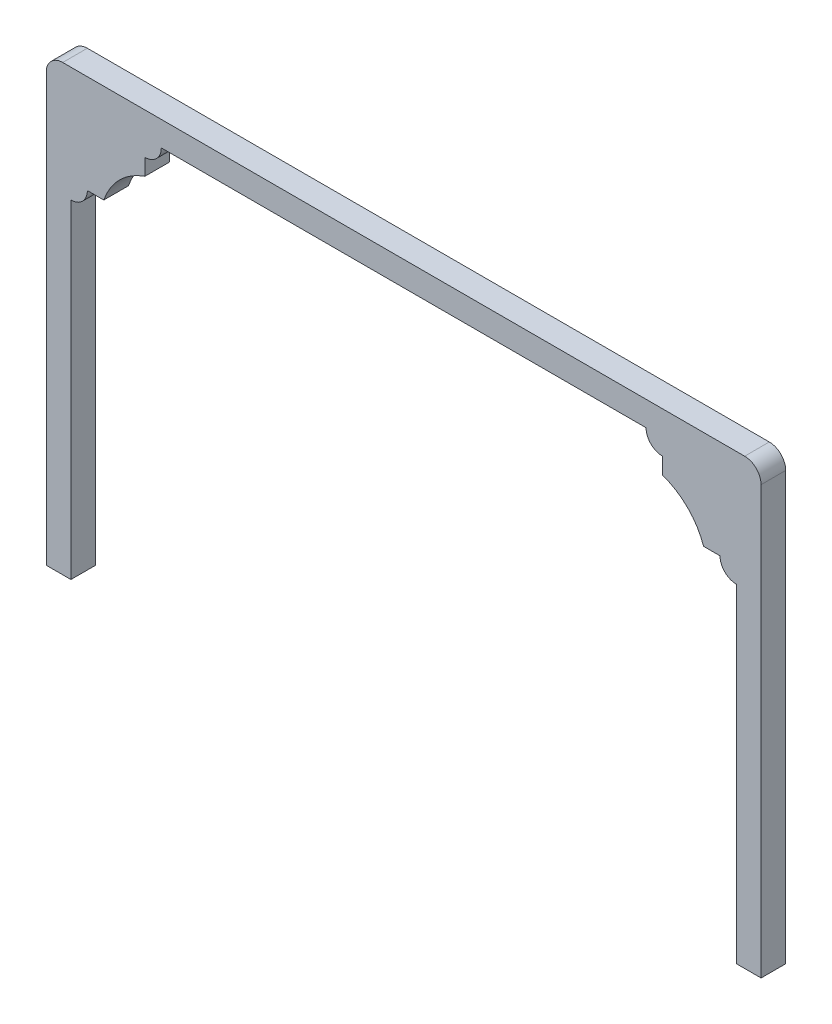
ISO-10303-21;
HEADER;
FILE_DESCRIPTION(('STEP AP214'),'2;1');
FILE_NAME('part.step','',(''),(''),'','','');
FILE_SCHEMA(('AUTOMOTIVE_DESIGN { 1 0 10303 214 1 1 1 1 }'));
ENDSEC;
DATA;
#1=APPLICATION_CONTEXT('core data for automotive mechanical design processes');
#2=APPLICATION_PROTOCOL_DEFINITION('international standard','automotive_design',2000,#1);
#3=PRODUCT_CONTEXT('',#1,'mechanical');
#4=PRODUCT('Part','Part','',(#3));
#5=PRODUCT_RELATED_PRODUCT_CATEGORY('part','',(#4));
#6=PRODUCT_DEFINITION_FORMATION('','',#4);
#7=PRODUCT_DEFINITION_CONTEXT('part definition',#1,'design');
#8=PRODUCT_DEFINITION('design','',#6,#7);
#9=PRODUCT_DEFINITION_SHAPE('','',#8);
#10=(LENGTH_UNIT() NAMED_UNIT(*) SI_UNIT(.MILLI.,.METRE.));
#11=(NAMED_UNIT(*) PLANE_ANGLE_UNIT() SI_UNIT($,.RADIAN.));
#12=(NAMED_UNIT(*) SI_UNIT($,.STERADIAN.) SOLID_ANGLE_UNIT());
#13=UNCERTAINTY_MEASURE_WITH_UNIT(LENGTH_MEASURE(1.E-05),#10,'distance_accuracy_value','');
#14=(GEOMETRIC_REPRESENTATION_CONTEXT(3) GLOBAL_UNCERTAINTY_ASSIGNED_CONTEXT((#13)) GLOBAL_UNIT_ASSIGNED_CONTEXT((#10,
#11,#12)) REPRESENTATION_CONTEXT('',''));
#15=CARTESIAN_POINT('',(0.,0.,0.));
#16=DIRECTION('',(0.,0.,1.));
#17=DIRECTION('',(1.,0.,0.));
#18=AXIS2_PLACEMENT_3D('',#15,#16,#17);
#19=CARTESIAN_POINT('',(276.225,0.,19.05));
#20=DIRECTION('',(-1.,0.,0.));
#21=DIRECTION('',(0.,-1.,0.));
#22=AXIS2_PLACEMENT_3D('',#19,#20,#21);
#23=PLANE('',#22);
#24=DIRECTION('',(0.,1.,0.));
#25=VECTOR('',#24,1.);
#26=CARTESIAN_POINT('',(276.225,0.,0.));
#27=LINE('',#26,#25);
#28=CARTESIAN_POINT('',(276.225,0.,0.));
#29=VERTEX_POINT('',#28);
#30=CARTESIAN_POINT('',(276.225,330.2,0.));
#31=VERTEX_POINT('',#30);
#32=EDGE_CURVE('E201',#29,#31,#27,.T.);
#33=ORIENTED_EDGE('',*,*,#32,.T.);
#34=DIRECTION('',(0.,0.,-1.));
#35=VECTOR('',#34,1.);
#36=CARTESIAN_POINT('',(276.225,330.2,19.05));
#37=LINE('',#36,#35);
#38=CARTESIAN_POINT('',(276.225,330.2,19.05));
#39=VERTEX_POINT('',#38);
#40=EDGE_CURVE('E11',#39,#31,#37,.T.);
#41=ORIENTED_EDGE('',*,*,#40,.F.);
#42=DIRECTION('',(0.,1.,0.));
#43=VECTOR('',#42,1.);
#44=CARTESIAN_POINT('',(276.225,0.,19.05));
#45=LINE('',#44,#43);
#46=CARTESIAN_POINT('',(276.225,0.,19.05));
#47=VERTEX_POINT('',#46);
#48=EDGE_CURVE('E240',#47,#39,#45,.T.);
#49=ORIENTED_EDGE('',*,*,#48,.F.);
#50=DIRECTION('',(0.,0.,-1.));
#51=VECTOR('',#50,1.);
#52=CARTESIAN_POINT('',(276.225,0.,19.05));
#53=LINE('',#52,#51);
#54=EDGE_CURVE('E197',#47,#29,#53,.T.);
#55=ORIENTED_EDGE('',*,*,#54,.T.);
#56=EDGE_LOOP('',(#33,#41,#49,#55));
#57=FACE_BOUND('',#56,.T.);
#58=ADVANCED_FACE('F33',(#57),#23,.F.);
#59=CARTESIAN_POINT('',(263.525,330.2,19.05));
#60=DIRECTION('',(0.,0.,-1.));
#61=DIRECTION('',(-1.,0.,0.));
#62=AXIS2_PLACEMENT_3D('',#59,#60,#61);
#63=CYLINDRICAL_SURFACE('',#62,12.7);
#64=CARTESIAN_POINT('',(263.525,330.2,0.));
#65=DIRECTION('',(0.,0.,1.));
#66=DIRECTION('',(-1.,0.,0.));
#67=AXIS2_PLACEMENT_3D('',#64,#65,#66);
#68=CIRCLE('',#67,12.7);
#69=CARTESIAN_POINT('',(263.525,342.9,0.));
#70=VERTEX_POINT('',#69);
#71=EDGE_CURVE('E204',#31,#70,#68,.T.);
#72=ORIENTED_EDGE('',*,*,#71,.T.);
#73=DIRECTION('',(0.,0.,-1.));
#74=VECTOR('',#73,1.);
#75=CARTESIAN_POINT('',(263.525,342.9,19.05));
#76=LINE('',#75,#74);
#77=CARTESIAN_POINT('',(263.525,342.9,19.05));
#78=VERTEX_POINT('',#77);
#79=EDGE_CURVE('E41',#78,#70,#76,.T.);
#80=ORIENTED_EDGE('',*,*,#79,.F.);
#81=CARTESIAN_POINT('',(263.525,330.2,19.05));
#82=DIRECTION('',(0.,0.,1.));
#83=DIRECTION('',(-1.,0.,0.));
#84=AXIS2_PLACEMENT_3D('',#81,#82,#83);
#85=CIRCLE('',#84,12.7);
#86=EDGE_CURVE('E127',#39,#78,#85,.T.);
#87=ORIENTED_EDGE('',*,*,#86,.F.);
#88=ORIENTED_EDGE('',*,*,#40,.T.);
#89=EDGE_LOOP('',(#72,#80,#87,#88));
#90=FACE_BOUND('',#89,.T.);
#91=ADVANCED_FACE('F358',(#90),#63,.T.);
#92=CARTESIAN_POINT('',(263.525,342.9,19.05));
#93=DIRECTION('',(0.,-1.,0.));
#94=DIRECTION('',(0.,0.,-1.));
#95=AXIS2_PLACEMENT_3D('',#92,#93,#94);
#96=PLANE('',#95);
#97=DIRECTION('',(-1.,0.,0.));
#98=VECTOR('',#97,1.);
#99=CARTESIAN_POINT('',(263.525,342.9,0.));
#100=LINE('',#99,#98);
#101=CARTESIAN_POINT('',(-263.525,342.9,0.));
#102=VERTEX_POINT('',#101);
#103=EDGE_CURVE('E206',#70,#102,#100,.T.);
#104=ORIENTED_EDGE('',*,*,#103,.T.);
#105=DIRECTION('',(0.,0.,-1.));
#106=VECTOR('',#105,1.);
#107=CARTESIAN_POINT('',(-263.525,342.9,19.05));
#108=LINE('',#107,#106);
#109=CARTESIAN_POINT('',(-263.525,342.9,19.05));
#110=VERTEX_POINT('',#109);
#111=EDGE_CURVE('E283',#110,#102,#108,.T.);
#112=ORIENTED_EDGE('',*,*,#111,.F.);
#113=DIRECTION('',(-1.,0.,0.));
#114=VECTOR('',#113,1.);
#115=CARTESIAN_POINT('',(263.525,342.9,19.05));
#116=LINE('',#115,#114);
#117=EDGE_CURVE('E291',#78,#110,#116,.T.);
#118=ORIENTED_EDGE('',*,*,#117,.F.);
#119=ORIENTED_EDGE('',*,*,#79,.T.);
#120=EDGE_LOOP('',(#104,#112,#118,#119));
#121=FACE_BOUND('',#120,.T.);
#122=ADVANCED_FACE('F289',(#121),#96,.F.);
#123=CARTESIAN_POINT('',(-263.525,330.2,19.05));
#124=DIRECTION('',(0.,0.,-1.));
#125=DIRECTION('',(-1.,0.,0.));
#126=AXIS2_PLACEMENT_3D('',#123,#124,#125);
#127=CYLINDRICAL_SURFACE('',#126,12.7);
#128=CARTESIAN_POINT('',(-263.525,330.2,0.));
#129=DIRECTION('',(0.,0.,1.));
#130=DIRECTION('',(1.,0.,0.));
#131=AXIS2_PLACEMENT_3D('',#128,#129,#130);
#132=CIRCLE('',#131,12.7);
#133=CARTESIAN_POINT('',(-276.225,330.2,0.));
#134=VERTEX_POINT('',#133);
#135=EDGE_CURVE('E208',#102,#134,#132,.T.);
#136=ORIENTED_EDGE('',*,*,#135,.T.);
#137=DIRECTION('',(0.,0.,-1.));
#138=VECTOR('',#137,1.);
#139=CARTESIAN_POINT('',(-276.225,330.2,19.05));
#140=LINE('',#139,#138);
#141=CARTESIAN_POINT('',(-276.225,330.2,19.05));
#142=VERTEX_POINT('',#141);
#143=EDGE_CURVE('E280',#142,#134,#140,.T.);
#144=ORIENTED_EDGE('',*,*,#143,.F.);
#145=CARTESIAN_POINT('',(-263.525,330.2,19.05));
#146=DIRECTION('',(0.,0.,1.));
#147=DIRECTION('',(1.,0.,0.));
#148=AXIS2_PLACEMENT_3D('',#145,#146,#147);
#149=CIRCLE('',#148,12.7);
#150=EDGE_CURVE('E309',#110,#142,#149,.T.);
#151=ORIENTED_EDGE('',*,*,#150,.F.);
#152=ORIENTED_EDGE('',*,*,#111,.T.);
#153=EDGE_LOOP('',(#136,#144,#151,#152));
#154=FACE_BOUND('',#153,.T.);
#155=ADVANCED_FACE('F300',(#154),#127,.T.);
#156=CARTESIAN_POINT('',(-276.225,0.,19.05));
#157=DIRECTION('',(1.,0.,0.));
#158=DIRECTION('',(0.,1.,0.));
#159=AXIS2_PLACEMENT_3D('',#156,#157,#158);
#160=PLANE('',#159);
#161=DIRECTION('',(0.,-1.,0.));
#162=VECTOR('',#161,1.);
#163=CARTESIAN_POINT('',(-276.225,0.,0.));
#164=LINE('',#163,#162);
#165=CARTESIAN_POINT('',(-276.225,0.,0.));
#166=VERTEX_POINT('',#165);
#167=EDGE_CURVE('E210',#134,#166,#164,.T.);
#168=ORIENTED_EDGE('',*,*,#167,.T.);
#169=DIRECTION('',(0.,0.,-1.));
#170=VECTOR('',#169,1.);
#171=CARTESIAN_POINT('',(-276.225,0.,19.05));
#172=LINE('',#171,#170);
#173=CARTESIAN_POINT('',(-276.225,0.,19.05));
#174=VERTEX_POINT('',#173);
#175=EDGE_CURVE('E277',#174,#166,#172,.T.);
#176=ORIENTED_EDGE('',*,*,#175,.F.);
#177=DIRECTION('',(0.,-1.,0.));
#178=VECTOR('',#177,1.);
#179=CARTESIAN_POINT('',(-276.225,0.,19.05));
#180=LINE('',#179,#178);
#181=EDGE_CURVE('E306',#142,#174,#180,.T.);
#182=ORIENTED_EDGE('',*,*,#181,.F.);
#183=ORIENTED_EDGE('',*,*,#143,.T.);
#184=EDGE_LOOP('',(#168,#176,#182,#183));
#185=FACE_BOUND('',#184,.T.);
#186=ADVANCED_FACE('F304',(#185),#160,.F.);
#187=CARTESIAN_POINT('',(-276.225,0.,19.05));
#188=DIRECTION('',(0.,1.,0.));
#189=DIRECTION('',(-1.,0.,0.));
#190=AXIS2_PLACEMENT_3D('',#187,#188,#189);
#191=PLANE('',#190);
#192=DIRECTION('',(1.,0.,0.));
#193=VECTOR('',#192,1.);
#194=CARTESIAN_POINT('',(-276.225,0.,0.));
#195=LINE('',#194,#193);
#196=CARTESIAN_POINT('',(-257.175,0.,0.));
#197=VERTEX_POINT('',#196);
#198=EDGE_CURVE('E212',#166,#197,#195,.T.);
#199=ORIENTED_EDGE('',*,*,#198,.T.);
#200=DIRECTION('',(0.,0.,-1.));
#201=VECTOR('',#200,1.);
#202=CARTESIAN_POINT('',(-257.175,0.,19.05));
#203=LINE('',#202,#201);
#204=CARTESIAN_POINT('',(-257.175,0.,19.05));
#205=VERTEX_POINT('',#204);
#206=EDGE_CURVE('E274',#205,#197,#203,.T.);
#207=ORIENTED_EDGE('',*,*,#206,.F.);
#208=DIRECTION('',(1.,0.,0.));
#209=VECTOR('',#208,1.);
#210=CARTESIAN_POINT('',(-276.225,0.,19.05));
#211=LINE('',#210,#209);
#212=EDGE_CURVE('E308',#174,#205,#211,.T.);
#213=ORIENTED_EDGE('',*,*,#212,.F.);
#214=ORIENTED_EDGE('',*,*,#175,.T.);
#215=EDGE_LOOP('',(#199,#207,#213,#214));
#216=FACE_BOUND('',#215,.T.);
#217=ADVANCED_FACE('F371',(#216),#191,.F.);
#218=CARTESIAN_POINT('',(-257.175,165.1,19.05));
#219=DIRECTION('',(-1.,0.,0.));
#220=DIRECTION('',(0.,-1.,0.));
#221=AXIS2_PLACEMENT_3D('',#218,#219,#220);
#222=PLANE('',#221);
#223=DIRECTION('',(0.,1.,0.));
#224=VECTOR('',#223,1.);
#225=CARTESIAN_POINT('',(-257.175,165.1,0.));
#226=LINE('',#225,#224);
#227=CARTESIAN_POINT('',(-257.175,254.,0.));
#228=VERTEX_POINT('',#227);
#229=EDGE_CURVE('E215',#197,#228,#226,.T.);
#230=ORIENTED_EDGE('',*,*,#229,.T.);
#231=DIRECTION('',(0.,0.,-1.));
#232=VECTOR('',#231,1.);
#233=CARTESIAN_POINT('',(-257.175,254.,19.05));
#234=LINE('',#233,#232);
#235=CARTESIAN_POINT('',(-257.175,254.,19.05));
#236=VERTEX_POINT('',#235);
#237=EDGE_CURVE('E271',#236,#228,#234,.T.);
#238=ORIENTED_EDGE('',*,*,#237,.F.);
#239=DIRECTION('',(0.,1.,0.));
#240=VECTOR('',#239,1.);
#241=CARTESIAN_POINT('',(-257.175,0.,19.05));
#242=LINE('',#241,#240);
#243=EDGE_CURVE('E311',#205,#236,#242,.T.);
#244=ORIENTED_EDGE('',*,*,#243,.F.);
#245=ORIENTED_EDGE('',*,*,#206,.T.);
#246=EDGE_LOOP('',(#230,#238,#244,#245));
#247=FACE_BOUND('',#246,.T.);
#248=ADVANCED_FACE('F374',(#247),#222,.F.);
#249=CARTESIAN_POINT('',(-257.175,266.7,19.05));
#250=DIRECTION('',(0.,0.,-1.));
#251=DIRECTION('',(-1.,0.,0.));
#252=AXIS2_PLACEMENT_3D('',#249,#250,#251);
#253=CYLINDRICAL_SURFACE('',#252,12.7);
#254=CARTESIAN_POINT('',(-257.175,266.7,0.));
#255=DIRECTION('',(0.,0.,1.));
#256=DIRECTION('',(1.,0.,0.));
#257=AXIS2_PLACEMENT_3D('',#254,#255,#256);
#258=CIRCLE('',#257,12.7);
#259=CARTESIAN_POINT('',(-244.475,266.7,0.));
#260=VERTEX_POINT('',#259);
#261=EDGE_CURVE('E217',#228,#260,#258,.T.);
#262=ORIENTED_EDGE('',*,*,#261,.T.);
#263=DIRECTION('',(0.,0.,-1.));
#264=VECTOR('',#263,1.);
#265=CARTESIAN_POINT('',(-244.475,266.7,19.05));
#266=LINE('',#265,#264);
#267=CARTESIAN_POINT('',(-244.475,266.7,19.05));
#268=VERTEX_POINT('',#267);
#269=EDGE_CURVE('E268',#268,#260,#266,.T.);
#270=ORIENTED_EDGE('',*,*,#269,.F.);
#271=CARTESIAN_POINT('',(-257.175,266.7,19.05));
#272=DIRECTION('',(0.,0.,1.));
#273=DIRECTION('',(1.,0.,0.));
#274=AXIS2_PLACEMENT_3D('',#271,#272,#273);
#275=CIRCLE('',#274,12.7);
#276=EDGE_CURVE('E317',#236,#268,#275,.T.);
#277=ORIENTED_EDGE('',*,*,#276,.F.);
#278=ORIENTED_EDGE('',*,*,#237,.T.);
#279=EDGE_LOOP('',(#262,#270,#277,#278));
#280=FACE_BOUND('',#279,.T.);
#281=ADVANCED_FACE('F378',(#280),#253,.T.);
#282=CARTESIAN_POINT('',(-244.475,266.7,19.05));
#283=DIRECTION('',(0.,1.,0.));
#284=DIRECTION('',(0.,0.,1.));
#285=AXIS2_PLACEMENT_3D('',#282,#283,#284);
#286=PLANE('',#285);
#287=DIRECTION('',(1.,0.,0.));
#288=VECTOR('',#287,1.);
#289=CARTESIAN_POINT('',(-244.475,266.7,0.));
#290=LINE('',#289,#288);
#291=CARTESIAN_POINT('',(-231.775,266.7,0.));
#292=VERTEX_POINT('',#291);
#293=EDGE_CURVE('E219',#260,#292,#290,.T.);
#294=ORIENTED_EDGE('',*,*,#293,.T.);
#295=DIRECTION('',(0.,0.,-1.));
#296=VECTOR('',#295,1.);
#297=CARTESIAN_POINT('',(-231.775,266.7,19.05));
#298=LINE('',#297,#296);
#299=CARTESIAN_POINT('',(-231.775,266.7,19.05));
#300=VERTEX_POINT('',#299);
#301=EDGE_CURVE('E265',#300,#292,#298,.T.);
#302=ORIENTED_EDGE('',*,*,#301,.F.);
#303=DIRECTION('',(1.,0.,0.));
#304=VECTOR('',#303,1.);
#305=CARTESIAN_POINT('',(-244.475,266.7,19.05));
#306=LINE('',#305,#304);
#307=EDGE_CURVE('E319',#268,#300,#306,.T.);
#308=ORIENTED_EDGE('',*,*,#307,.F.);
#309=ORIENTED_EDGE('',*,*,#269,.T.);
#310=EDGE_LOOP('',(#294,#302,#308,#309));
#311=FACE_BOUND('',#310,.T.);
#312=ADVANCED_FACE('F382',(#311),#286,.F.);
#313=CARTESIAN_POINT('',(-183.677269280832,250.352269280832,19.05));
#314=DIRECTION('',(0.,0.,-1.));
#315=DIRECTION('',(-1.,0.,0.));
#316=AXIS2_PLACEMENT_3D('',#313,#314,#315);
#317=CYLINDRICAL_SURFACE('',#316,50.8);
#318=CARTESIAN_POINT('',(-183.677269280832,250.352269280832,0.));
#319=DIRECTION('',(0.,0.,-1.));
#320=DIRECTION('',(-1.,0.,0.));
#321=AXIS2_PLACEMENT_3D('',#318,#319,#320);
#322=CIRCLE('',#321,50.8);
#323=CARTESIAN_POINT('',(-200.025,298.45,0.));
#324=VERTEX_POINT('',#323);
#325=EDGE_CURVE('E221',#292,#324,#322,.T.);
#326=ORIENTED_EDGE('',*,*,#325,.T.);
#327=DIRECTION('',(0.,0.,-1.));
#328=VECTOR('',#327,1.);
#329=CARTESIAN_POINT('',(-200.025,298.45,19.05));
#330=LINE('',#329,#328);
#331=CARTESIAN_POINT('',(-200.025,298.45,19.05));
#332=VERTEX_POINT('',#331);
#333=EDGE_CURVE('E262',#332,#324,#330,.T.);
#334=ORIENTED_EDGE('',*,*,#333,.F.);
#335=CARTESIAN_POINT('',(-183.677269280832,250.352269280832,19.05));
#336=DIRECTION('',(0.,0.,-1.));
#337=DIRECTION('',(-1.,0.,0.));
#338=AXIS2_PLACEMENT_3D('',#335,#336,#337);
#339=CIRCLE('',#338,50.8);
#340=EDGE_CURVE('E321',#300,#332,#339,.T.);
#341=ORIENTED_EDGE('',*,*,#340,.F.);
#342=ORIENTED_EDGE('',*,*,#301,.T.);
#343=EDGE_LOOP('',(#326,#334,#341,#342));
#344=FACE_BOUND('',#343,.T.);
#345=ADVANCED_FACE('F386',(#344),#317,.F.);
#346=CARTESIAN_POINT('',(-200.025,311.15,19.05));
#347=DIRECTION('',(-1.,0.,0.));
#348=DIRECTION('',(0.,-1.,0.));
#349=AXIS2_PLACEMENT_3D('',#346,#347,#348);
#350=PLANE('',#349);
#351=DIRECTION('',(0.,1.,0.));
#352=VECTOR('',#351,1.);
#353=CARTESIAN_POINT('',(-200.025,311.15,0.));
#354=LINE('',#353,#352);
#355=CARTESIAN_POINT('',(-200.025,311.15,0.));
#356=VERTEX_POINT('',#355);
#357=EDGE_CURVE('E223',#324,#356,#354,.T.);
#358=ORIENTED_EDGE('',*,*,#357,.T.);
#359=DIRECTION('',(0.,0.,-1.));
#360=VECTOR('',#359,1.);
#361=CARTESIAN_POINT('',(-200.025,311.15,19.05));
#362=LINE('',#361,#360);
#363=CARTESIAN_POINT('',(-200.025,311.15,19.05));
#364=VERTEX_POINT('',#363);
#365=EDGE_CURVE('E259',#364,#356,#362,.T.);
#366=ORIENTED_EDGE('',*,*,#365,.F.);
#367=DIRECTION('',(0.,1.,0.));
#368=VECTOR('',#367,1.);
#369=CARTESIAN_POINT('',(-200.025,311.15,19.05));
#370=LINE('',#369,#368);
#371=EDGE_CURVE('E323',#332,#364,#370,.T.);
#372=ORIENTED_EDGE('',*,*,#371,.F.);
#373=ORIENTED_EDGE('',*,*,#333,.T.);
#374=EDGE_LOOP('',(#358,#366,#372,#373));
#375=FACE_BOUND('',#374,.T.);
#376=ADVANCED_FACE('F390',(#375),#350,.F.);
#377=CARTESIAN_POINT('',(-200.025,323.85,19.05));
#378=DIRECTION('',(0.,0.,-1.));
#379=DIRECTION('',(-1.,0.,0.));
#380=AXIS2_PLACEMENT_3D('',#377,#378,#379);
#381=CYLINDRICAL_SURFACE('',#380,12.7);
#382=CARTESIAN_POINT('',(-200.025,323.85,0.));
#383=DIRECTION('',(0.,0.,1.));
#384=DIRECTION('',(1.,0.,0.));
#385=AXIS2_PLACEMENT_3D('',#382,#383,#384);
#386=CIRCLE('',#385,12.7);
#387=CARTESIAN_POINT('',(-187.325,323.85,0.));
#388=VERTEX_POINT('',#387);
#389=EDGE_CURVE('E225',#356,#388,#386,.T.);
#390=ORIENTED_EDGE('',*,*,#389,.T.);
#391=DIRECTION('',(0.,0.,-1.));
#392=VECTOR('',#391,1.);
#393=CARTESIAN_POINT('',(-187.325,323.85,19.05));
#394=LINE('',#393,#392);
#395=CARTESIAN_POINT('',(-187.325,323.85,19.05));
#396=VERTEX_POINT('',#395);
#397=EDGE_CURVE('E256',#396,#388,#394,.T.);
#398=ORIENTED_EDGE('',*,*,#397,.F.);
#399=CARTESIAN_POINT('',(-200.025,323.85,19.05));
#400=DIRECTION('',(0.,0.,1.));
#401=DIRECTION('',(1.,0.,0.));
#402=AXIS2_PLACEMENT_3D('',#399,#400,#401);
#403=CIRCLE('',#402,12.7);
#404=EDGE_CURVE('E325',#364,#396,#403,.T.);
#405=ORIENTED_EDGE('',*,*,#404,.F.);
#406=ORIENTED_EDGE('',*,*,#365,.T.);
#407=EDGE_LOOP('',(#390,#398,#405,#406));
#408=FACE_BOUND('',#407,.T.);
#409=ADVANCED_FACE('F394',(#408),#381,.T.);
#410=CARTESIAN_POINT('',(-187.325,323.85,19.05));
#411=DIRECTION('',(0.,1.,0.));
#412=DIRECTION('',(0.,0.,1.));
#413=AXIS2_PLACEMENT_3D('',#410,#411,#412);
#414=PLANE('',#413);
#415=DIRECTION('',(1.,0.,0.));
#416=VECTOR('',#415,1.);
#417=CARTESIAN_POINT('',(-187.325,323.85,0.));
#418=LINE('',#417,#416);
#419=CARTESIAN_POINT('',(187.325,323.85,0.));
#420=VERTEX_POINT('',#419);
#421=EDGE_CURVE('E227',#388,#420,#418,.T.);
#422=ORIENTED_EDGE('',*,*,#421,.T.);
#423=DIRECTION('',(0.,0.,-1.));
#424=VECTOR('',#423,1.);
#425=CARTESIAN_POINT('',(187.325,323.85,19.05));
#426=LINE('',#425,#424);
#427=CARTESIAN_POINT('',(187.325,323.85,19.05));
#428=VERTEX_POINT('',#427);
#429=EDGE_CURVE('E253',#428,#420,#426,.T.);
#430=ORIENTED_EDGE('',*,*,#429,.F.);
#431=DIRECTION('',(1.,0.,0.));
#432=VECTOR('',#431,1.);
#433=CARTESIAN_POINT('',(-187.325,323.85,19.05));
#434=LINE('',#433,#432);
#435=EDGE_CURVE('E327',#396,#428,#434,.T.);
#436=ORIENTED_EDGE('',*,*,#435,.F.);
#437=ORIENTED_EDGE('',*,*,#397,.T.);
#438=EDGE_LOOP('',(#422,#430,#436,#437));
#439=FACE_BOUND('',#438,.T.);
#440=ADVANCED_FACE('F398',(#439),#414,.F.);
#441=CARTESIAN_POINT('',(200.025,323.85,19.05));
#442=DIRECTION('',(0.,0.,-1.));
#443=DIRECTION('',(-1.,0.,0.));
#444=AXIS2_PLACEMENT_3D('',#441,#442,#443);
#445=CYLINDRICAL_SURFACE('',#444,12.7);
#446=CARTESIAN_POINT('',(200.025,323.85,0.));
#447=DIRECTION('',(0.,0.,1.));
#448=DIRECTION('',(-1.,0.,0.));
#449=AXIS2_PLACEMENT_3D('',#446,#447,#448);
#450=CIRCLE('',#449,12.7);
#451=CARTESIAN_POINT('',(200.025,311.15,0.));
#452=VERTEX_POINT('',#451);
#453=EDGE_CURVE('E229',#420,#452,#450,.T.);
#454=ORIENTED_EDGE('',*,*,#453,.T.);
#455=DIRECTION('',(0.,0.,-1.));
#456=VECTOR('',#455,1.);
#457=CARTESIAN_POINT('',(200.025,311.15,19.05));
#458=LINE('',#457,#456);
#459=CARTESIAN_POINT('',(200.025,311.15,19.05));
#460=VERTEX_POINT('',#459);
#461=EDGE_CURVE('E250',#460,#452,#458,.T.);
#462=ORIENTED_EDGE('',*,*,#461,.F.);
#463=CARTESIAN_POINT('',(200.025,323.85,19.05));
#464=DIRECTION('',(0.,0.,1.));
#465=DIRECTION('',(-1.,0.,0.));
#466=AXIS2_PLACEMENT_3D('',#463,#464,#465);
#467=CIRCLE('',#466,12.7);
#468=EDGE_CURVE('E329',#428,#460,#467,.T.);
#469=ORIENTED_EDGE('',*,*,#468,.F.);
#470=ORIENTED_EDGE('',*,*,#429,.T.);
#471=EDGE_LOOP('',(#454,#462,#469,#470));
#472=FACE_BOUND('',#471,.T.);
#473=ADVANCED_FACE('F402',(#472),#445,.T.);
#474=CARTESIAN_POINT('',(200.025,311.15,19.05));
#475=DIRECTION('',(1.,0.,0.));
#476=DIRECTION('',(0.,1.,0.));
#477=AXIS2_PLACEMENT_3D('',#474,#475,#476);
#478=PLANE('',#477);
#479=DIRECTION('',(0.,-1.,0.));
#480=VECTOR('',#479,1.);
#481=CARTESIAN_POINT('',(200.025,311.15,0.));
#482=LINE('',#481,#480);
#483=CARTESIAN_POINT('',(200.025,298.45,0.));
#484=VERTEX_POINT('',#483);
#485=EDGE_CURVE('E231',#452,#484,#482,.T.);
#486=ORIENTED_EDGE('',*,*,#485,.T.);
#487=DIRECTION('',(0.,0.,-1.));
#488=VECTOR('',#487,1.);
#489=CARTESIAN_POINT('',(200.025,298.45,19.05));
#490=LINE('',#489,#488);
#491=CARTESIAN_POINT('',(200.025,298.45,19.05));
#492=VERTEX_POINT('',#491);
#493=EDGE_CURVE('E247',#492,#484,#490,.T.);
#494=ORIENTED_EDGE('',*,*,#493,.F.);
#495=DIRECTION('',(0.,-1.,0.));
#496=VECTOR('',#495,1.);
#497=CARTESIAN_POINT('',(200.025,311.15,19.05));
#498=LINE('',#497,#496);
#499=EDGE_CURVE('E331',#460,#492,#498,.T.);
#500=ORIENTED_EDGE('',*,*,#499,.F.);
#501=ORIENTED_EDGE('',*,*,#461,.T.);
#502=EDGE_LOOP('',(#486,#494,#500,#501));
#503=FACE_BOUND('',#502,.T.);
#504=ADVANCED_FACE('F406',(#503),#478,.F.);
#505=CARTESIAN_POINT('',(183.677269280832,250.352269280832,19.05));
#506=DIRECTION('',(0.,0.,-1.));
#507=DIRECTION('',(-1.,0.,0.));
#508=AXIS2_PLACEMENT_3D('',#505,#506,#507);
#509=CYLINDRICAL_SURFACE('',#508,50.8);
#510=CARTESIAN_POINT('',(183.677269280832,250.352269280832,0.));
#511=DIRECTION('',(0.,0.,-1.));
#512=DIRECTION('',(1.,0.,0.));
#513=AXIS2_PLACEMENT_3D('',#510,#511,#512);
#514=CIRCLE('',#513,50.8);
#515=CARTESIAN_POINT('',(231.775,266.7,0.));
#516=VERTEX_POINT('',#515);
#517=EDGE_CURVE('E233',#484,#516,#514,.T.);
#518=ORIENTED_EDGE('',*,*,#517,.T.);
#519=DIRECTION('',(0.,0.,-1.));
#520=VECTOR('',#519,1.);
#521=CARTESIAN_POINT('',(231.775,266.7,19.05));
#522=LINE('',#521,#520);
#523=CARTESIAN_POINT('',(231.775,266.7,19.05));
#524=VERTEX_POINT('',#523);
#525=EDGE_CURVE('E244',#524,#516,#522,.T.);
#526=ORIENTED_EDGE('',*,*,#525,.F.);
#527=CARTESIAN_POINT('',(183.677269280832,250.352269280832,19.05));
#528=DIRECTION('',(0.,0.,-1.));
#529=DIRECTION('',(1.,0.,0.));
#530=AXIS2_PLACEMENT_3D('',#527,#528,#529);
#531=CIRCLE('',#530,50.8);
#532=EDGE_CURVE('E333',#492,#524,#531,.T.);
#533=ORIENTED_EDGE('',*,*,#532,.F.);
#534=ORIENTED_EDGE('',*,*,#493,.T.);
#535=EDGE_LOOP('',(#518,#526,#533,#534));
#536=FACE_BOUND('',#535,.T.);
#537=ADVANCED_FACE('F339',(#536),#509,.F.);
#538=CARTESIAN_POINT('',(244.475,266.7,19.05));
#539=DIRECTION('',(0.,1.,0.));
#540=DIRECTION('',(0.,0.,1.));
#541=AXIS2_PLACEMENT_3D('',#538,#539,#540);
#542=PLANE('',#541);
#543=DIRECTION('',(1.,0.,0.));
#544=VECTOR('',#543,1.);
#545=CARTESIAN_POINT('',(244.475,266.7,0.));
#546=LINE('',#545,#544);
#547=CARTESIAN_POINT('',(244.475,266.7,0.));
#548=VERTEX_POINT('',#547);
#549=EDGE_CURVE('E235',#516,#548,#546,.T.);
#550=ORIENTED_EDGE('',*,*,#549,.T.);
#551=DIRECTION('',(0.,0.,-1.));
#552=VECTOR('',#551,1.);
#553=CARTESIAN_POINT('',(244.475,266.7,19.05));
#554=LINE('',#553,#552);
#555=CARTESIAN_POINT('',(244.475,266.7,19.05));
#556=VERTEX_POINT('',#555);
#557=EDGE_CURVE('E192',#556,#548,#554,.T.);
#558=ORIENTED_EDGE('',*,*,#557,.F.);
#559=DIRECTION('',(1.,0.,0.));
#560=VECTOR('',#559,1.);
#561=CARTESIAN_POINT('',(244.475,266.7,19.05));
#562=LINE('',#561,#560);
#563=EDGE_CURVE('E182',#524,#556,#562,.T.);
#564=ORIENTED_EDGE('',*,*,#563,.F.);
#565=ORIENTED_EDGE('',*,*,#525,.T.);
#566=EDGE_LOOP('',(#550,#558,#564,#565));
#567=FACE_BOUND('',#566,.T.);
#568=ADVANCED_FACE('F343',(#567),#542,.F.);
#569=CARTESIAN_POINT('',(257.175,266.7,19.05));
#570=DIRECTION('',(0.,0.,-1.));
#571=DIRECTION('',(-1.,0.,0.));
#572=AXIS2_PLACEMENT_3D('',#569,#570,#571);
#573=CYLINDRICAL_SURFACE('',#572,12.7);
#574=CARTESIAN_POINT('',(257.175,266.7,0.));
#575=DIRECTION('',(0.,0.,1.));
#576=DIRECTION('',(-1.,0.,0.));
#577=AXIS2_PLACEMENT_3D('',#574,#575,#576);
#578=CIRCLE('',#577,12.7);
#579=CARTESIAN_POINT('',(257.175,254.,0.));
#580=VERTEX_POINT('',#579);
#581=EDGE_CURVE('E191',#548,#580,#578,.T.);
#582=ORIENTED_EDGE('',*,*,#581,.T.);
#583=DIRECTION('',(0.,0.,-1.));
#584=VECTOR('',#583,1.);
#585=CARTESIAN_POINT('',(257.175,254.,19.05));
#586=LINE('',#585,#584);
#587=CARTESIAN_POINT('',(257.175,254.,19.05));
#588=VERTEX_POINT('',#587);
#589=EDGE_CURVE('E188',#588,#580,#586,.T.);
#590=ORIENTED_EDGE('',*,*,#589,.F.);
#591=CARTESIAN_POINT('',(257.175,266.7,19.05));
#592=DIRECTION('',(0.,0.,1.));
#593=DIRECTION('',(-1.,0.,0.));
#594=AXIS2_PLACEMENT_3D('',#591,#592,#593);
#595=CIRCLE('',#594,12.7);
#596=EDGE_CURVE('E176',#556,#588,#595,.T.);
#597=ORIENTED_EDGE('',*,*,#596,.F.);
#598=ORIENTED_EDGE('',*,*,#557,.T.);
#599=EDGE_LOOP('',(#582,#590,#597,#598));
#600=FACE_BOUND('',#599,.T.);
#601=ADVANCED_FACE('F189',(#600),#573,.T.);
#602=CARTESIAN_POINT('',(257.175,0.,19.05));
#603=DIRECTION('',(1.,0.,0.));
#604=DIRECTION('',(0.,0.,-1.));
#605=AXIS2_PLACEMENT_3D('',#602,#603,#604);
#606=PLANE('',#605);
#607=DIRECTION('',(0.,-1.,0.));
#608=VECTOR('',#607,1.);
#609=CARTESIAN_POINT('',(257.175,0.,0.));
#610=LINE('',#609,#608);
#611=CARTESIAN_POINT('',(257.175,0.,0.));
#612=VERTEX_POINT('',#611);
#613=EDGE_CURVE('E113',#580,#612,#610,.T.);
#614=ORIENTED_EDGE('',*,*,#613,.T.);
#615=DIRECTION('',(0.,0.,-1.));
#616=VECTOR('',#615,1.);
#617=CARTESIAN_POINT('',(257.175,0.,19.05));
#618=LINE('',#617,#616);
#619=CARTESIAN_POINT('',(257.175,0.,19.05));
#620=VERTEX_POINT('',#619);
#621=EDGE_CURVE('E193',#620,#612,#618,.T.);
#622=ORIENTED_EDGE('',*,*,#621,.F.);
#623=DIRECTION('',(0.,-1.,0.));
#624=VECTOR('',#623,1.);
#625=CARTESIAN_POINT('',(257.175,165.1,19.05));
#626=LINE('',#625,#624);
#627=EDGE_CURVE('E180',#588,#620,#626,.T.);
#628=ORIENTED_EDGE('',*,*,#627,.F.);
#629=ORIENTED_EDGE('',*,*,#589,.T.);
#630=EDGE_LOOP('',(#614,#622,#628,#629));
#631=FACE_BOUND('',#630,.T.);
#632=ADVANCED_FACE('F195',(#631),#606,.F.);
#633=CARTESIAN_POINT('',(276.225,0.,19.05));
#634=DIRECTION('',(0.,1.,0.));
#635=DIRECTION('',(-1.,0.,0.));
#636=AXIS2_PLACEMENT_3D('',#633,#634,#635);
#637=PLANE('',#636);
#638=DIRECTION('',(1.,0.,0.));
#639=VECTOR('',#638,1.);
#640=CARTESIAN_POINT('',(276.225,0.,0.));
#641=LINE('',#640,#639);
#642=EDGE_CURVE('E119',#612,#29,#641,.T.);
#643=ORIENTED_EDGE('',*,*,#642,.T.);
#644=ORIENTED_EDGE('',*,*,#54,.F.);
#645=DIRECTION('',(1.,0.,0.));
#646=VECTOR('',#645,1.);
#647=CARTESIAN_POINT('',(276.225,0.,19.05));
#648=LINE('',#647,#646);
#649=EDGE_CURVE('E49',#620,#47,#648,.T.);
#650=ORIENTED_EDGE('',*,*,#649,.F.);
#651=ORIENTED_EDGE('',*,*,#621,.T.);
#652=EDGE_LOOP('',(#643,#644,#650,#651));
#653=FACE_BOUND('',#652,.T.);
#654=ADVANCED_FACE('F347',(#653),#637,.F.);
#655=CARTESIAN_POINT('',(263.525,330.2,19.05));
#656=DIRECTION('',(0.,0.,-1.));
#657=DIRECTION('',(-1.,0.,0.));
#658=AXIS2_PLACEMENT_3D('',#655,#656,#657);
#659=PLANE('',#658);
#660=ORIENTED_EDGE('',*,*,#48,.T.);
#661=ORIENTED_EDGE('',*,*,#86,.T.);
#662=ORIENTED_EDGE('',*,*,#117,.T.);
#663=ORIENTED_EDGE('',*,*,#150,.T.);
#664=ORIENTED_EDGE('',*,*,#181,.T.);
#665=ORIENTED_EDGE('',*,*,#212,.T.);
#666=ORIENTED_EDGE('',*,*,#243,.T.);
#667=ORIENTED_EDGE('',*,*,#276,.T.);
#668=ORIENTED_EDGE('',*,*,#307,.T.);
#669=ORIENTED_EDGE('',*,*,#340,.T.);
#670=ORIENTED_EDGE('',*,*,#371,.T.);
#671=ORIENTED_EDGE('',*,*,#404,.T.);
#672=ORIENTED_EDGE('',*,*,#435,.T.);
#673=ORIENTED_EDGE('',*,*,#468,.T.);
#674=ORIENTED_EDGE('',*,*,#499,.T.);
#675=ORIENTED_EDGE('',*,*,#532,.T.);
#676=ORIENTED_EDGE('',*,*,#563,.T.);
#677=ORIENTED_EDGE('',*,*,#596,.T.);
#678=ORIENTED_EDGE('',*,*,#627,.T.);
#679=ORIENTED_EDGE('',*,*,#649,.T.);
#680=EDGE_LOOP('',(#660,#661,#662,#663,#664,#665,#666,#667,#668,#669,#670,#671,#672,#673,#674,
#675,#676,#677,#678,#679));
#681=FACE_BOUND('',#680,.T.);
#682=ADVANCED_FACE('F178',(#681),#659,.F.);
#683=CARTESIAN_POINT('',(263.525,330.2,0.));
#684=DIRECTION('',(0.,0.,-1.));
#685=DIRECTION('',(-1.,0.,0.));
#686=AXIS2_PLACEMENT_3D('',#683,#684,#685);
#687=PLANE('',#686);
#688=ORIENTED_EDGE('',*,*,#32,.F.);
#689=ORIENTED_EDGE('',*,*,#642,.F.);
#690=ORIENTED_EDGE('',*,*,#613,.F.);
#691=ORIENTED_EDGE('',*,*,#581,.F.);
#692=ORIENTED_EDGE('',*,*,#549,.F.);
#693=ORIENTED_EDGE('',*,*,#517,.F.);
#694=ORIENTED_EDGE('',*,*,#485,.F.);
#695=ORIENTED_EDGE('',*,*,#453,.F.);
#696=ORIENTED_EDGE('',*,*,#421,.F.);
#697=ORIENTED_EDGE('',*,*,#389,.F.);
#698=ORIENTED_EDGE('',*,*,#357,.F.);
#699=ORIENTED_EDGE('',*,*,#325,.F.);
#700=ORIENTED_EDGE('',*,*,#293,.F.);
#701=ORIENTED_EDGE('',*,*,#261,.F.);
#702=ORIENTED_EDGE('',*,*,#229,.F.);
#703=ORIENTED_EDGE('',*,*,#198,.F.);
#704=ORIENTED_EDGE('',*,*,#167,.F.);
#705=ORIENTED_EDGE('',*,*,#135,.F.);
#706=ORIENTED_EDGE('',*,*,#103,.F.);
#707=ORIENTED_EDGE('',*,*,#71,.F.);
#708=EDGE_LOOP('',(#688,#689,#690,#691,#692,#693,#694,#695,#696,#697,#698,#699,#700,#701,#702,
#703,#704,#705,#706,#707));
#709=FACE_BOUND('',#708,.T.);
#710=ADVANCED_FACE('F295',(#709),#687,.T.);
#711=CLOSED_SHELL('',(#58,#91,#122,#155,#186,#217,#248,#281,#312,#345,#376,#409,#440,#473,#504,
#537,#568,#601,#632,#654,#682,#710));
#712=MANIFOLD_SOLID_BREP('B2',#711);
#713=ADVANCED_BREP_SHAPE_REPRESENTATION('',(#18,#712),#14);
#714=SHAPE_DEFINITION_REPRESENTATION(#9,#713);
ENDSEC;
END-ISO-10303-21;
